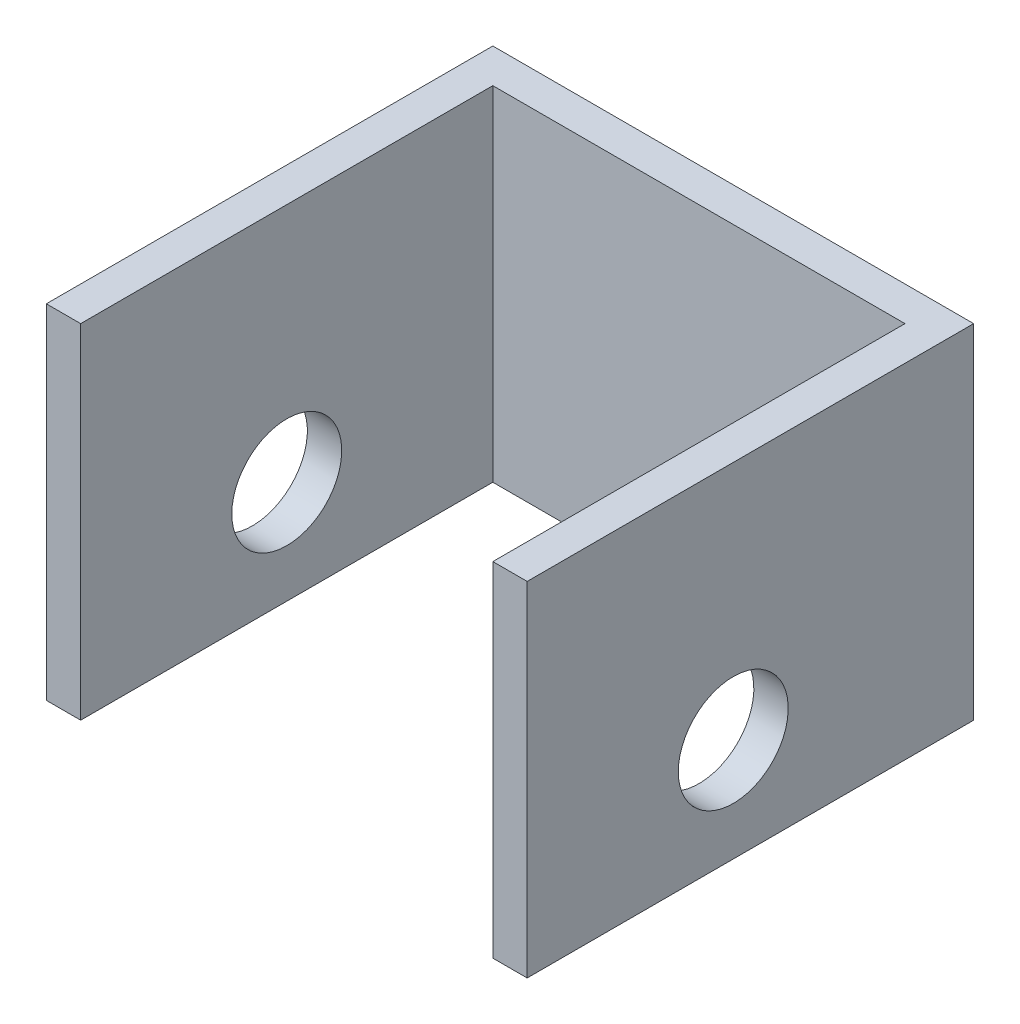
ISO-10303-21;
HEADER;
FILE_DESCRIPTION(('STEP AP214'),'2;1');
FILE_NAME('part.step','',(''),(''),'','','');
FILE_SCHEMA(('AUTOMOTIVE_DESIGN { 1 0 10303 214 1 1 1 1 }'));
ENDSEC;
DATA;
#1=APPLICATION_CONTEXT('core data for automotive mechanical design processes');
#2=APPLICATION_PROTOCOL_DEFINITION('international standard','automotive_design',2000,#1);
#3=PRODUCT_CONTEXT('',#1,'mechanical');
#4=PRODUCT('Part','Part','',(#3));
#5=PRODUCT_RELATED_PRODUCT_CATEGORY('part','',(#4));
#6=PRODUCT_DEFINITION_FORMATION('','',#4);
#7=PRODUCT_DEFINITION_CONTEXT('part definition',#1,'design');
#8=PRODUCT_DEFINITION('design','',#6,#7);
#9=PRODUCT_DEFINITION_SHAPE('','',#8);
#10=(LENGTH_UNIT() NAMED_UNIT(*) SI_UNIT(.MILLI.,.METRE.));
#11=(NAMED_UNIT(*) PLANE_ANGLE_UNIT() SI_UNIT($,.RADIAN.));
#12=(NAMED_UNIT(*) SI_UNIT($,.STERADIAN.) SOLID_ANGLE_UNIT());
#13=UNCERTAINTY_MEASURE_WITH_UNIT(LENGTH_MEASURE(1.E-05),#10,'distance_accuracy_value','');
#14=(GEOMETRIC_REPRESENTATION_CONTEXT(3) GLOBAL_UNCERTAINTY_ASSIGNED_CONTEXT((#13)) GLOBAL_UNIT_ASSIGNED_CONTEXT((#10,
#11,#12)) REPRESENTATION_CONTEXT('',''));
#15=CARTESIAN_POINT('',(0.,0.,0.));
#16=DIRECTION('',(0.,0.,1.));
#17=DIRECTION('',(1.,0.,0.));
#18=AXIS2_PLACEMENT_3D('',#15,#16,#17);
#19=CARTESIAN_POINT('',(0.,0.,5.));
#20=DIRECTION('',(0.,0.,-1.));
#21=DIRECTION('',(-1.,0.,0.));
#22=AXIS2_PLACEMENT_3D('',#19,#20,#21);
#23=PLANE('',#22);
#24=DIRECTION('',(0.,-1.,0.));
#25=VECTOR('',#24,1.);
#26=CARTESIAN_POINT('',(65.,50.,5.));
#27=LINE('',#26,#25);
#28=CARTESIAN_POINT('',(65.,50.,5.));
#29=VERTEX_POINT('',#28);
#30=CARTESIAN_POINT('',(65.,0.,5.));
#31=VERTEX_POINT('',#30);
#32=EDGE_CURVE('E123',#29,#31,#27,.T.);
#33=ORIENTED_EDGE('',*,*,#32,.F.);
#34=DIRECTION('',(-1.,0.,0.));
#35=VECTOR('',#34,1.);
#36=CARTESIAN_POINT('',(0.,50.,5.));
#37=LINE('',#36,#35);
#38=CARTESIAN_POINT('',(5.,50.,5.));
#39=VERTEX_POINT('',#38);
#40=EDGE_CURVE('E155',#29,#39,#37,.T.);
#41=ORIENTED_EDGE('',*,*,#40,.T.);
#42=DIRECTION('',(0.,1.,0.));
#43=VECTOR('',#42,1.);
#44=CARTESIAN_POINT('',(5.,50.,5.));
#45=LINE('',#44,#43);
#46=CARTESIAN_POINT('',(5.,0.,5.));
#47=VERTEX_POINT('',#46);
#48=EDGE_CURVE('E54',#47,#39,#45,.T.);
#49=ORIENTED_EDGE('',*,*,#48,.F.);
#50=DIRECTION('',(1.,0.,0.));
#51=VECTOR('',#50,1.);
#52=CARTESIAN_POINT('',(0.,0.,5.));
#53=LINE('',#52,#51);
#54=EDGE_CURVE('E49',#47,#31,#53,.T.);
#55=ORIENTED_EDGE('',*,*,#54,.T.);
#56=EDGE_LOOP('',(#33,#41,#49,#55));
#57=FACE_BOUND('',#56,.T.);
#58=ADVANCED_FACE('F33',(#57),#23,.F.);
#59=CARTESIAN_POINT('',(0.,0.,5.));
#60=DIRECTION('',(1.,0.,0.));
#61=DIRECTION('',(0.,0.,-1.));
#62=AXIS2_PLACEMENT_3D('',#59,#60,#61);
#63=PLANE('',#62);
#64=CARTESIAN_POINT('',(0.,15.,35.));
#65=DIRECTION('',(-1.,0.,0.));
#66=DIRECTION('',(0.,0.,1.));
#67=AXIS2_PLACEMENT_3D('',#64,#65,#66);
#68=CIRCLE('',#67,8.);
#69=CARTESIAN_POINT('',(0.,15.,43.));
#70=VERTEX_POINT('',#69);
#71=EDGE_CURVE('E307',#70,#70,#68,.T.);
#72=ORIENTED_EDGE('',*,*,#71,.F.);
#73=EDGE_LOOP('',(#72));
#74=FACE_BOUND('',#73,.T.);
#75=DIRECTION('',(0.,-1.,0.));
#76=VECTOR('',#75,1.);
#77=CARTESIAN_POINT('',(0.,0.,0.));
#78=LINE('',#77,#76);
#79=CARTESIAN_POINT('',(0.,50.,0.));
#80=VERTEX_POINT('',#79);
#81=CARTESIAN_POINT('',(0.,0.,0.));
#82=VERTEX_POINT('',#81);
#83=EDGE_CURVE('E153',#80,#82,#78,.T.);
#84=ORIENTED_EDGE('',*,*,#83,.T.);
#85=DIRECTION('',(0.,0.,-1.));
#86=VECTOR('',#85,1.);
#87=CARTESIAN_POINT('',(0.,0.,5.));
#88=LINE('',#87,#86);
#89=CARTESIAN_POINT('',(0.,0.,65.));
#90=VERTEX_POINT('',#89);
#91=EDGE_CURVE('E11',#90,#82,#88,.T.);
#92=ORIENTED_EDGE('',*,*,#91,.F.);
#93=DIRECTION('',(0.,-1.,0.));
#94=VECTOR('',#93,1.);
#95=CARTESIAN_POINT('',(0.,50.,65.));
#96=LINE('',#95,#94);
#97=CARTESIAN_POINT('',(0.,50.,65.));
#98=VERTEX_POINT('',#97);
#99=EDGE_CURVE('E136',#98,#90,#96,.T.);
#100=ORIENTED_EDGE('',*,*,#99,.F.);
#101=DIRECTION('',(0.,0.,-1.));
#102=VECTOR('',#101,1.);
#103=CARTESIAN_POINT('',(0.,50.,5.));
#104=LINE('',#103,#102);
#105=EDGE_CURVE('E108',#98,#80,#104,.T.);
#106=ORIENTED_EDGE('',*,*,#105,.T.);
#107=EDGE_LOOP('',(#84,#92,#100,#106));
#108=FACE_BOUND('',#107,.T.);
#109=ADVANCED_FACE('F35',(#74,#108),#63,.F.);
#110=CARTESIAN_POINT('',(0.,0.,5.));
#111=DIRECTION('',(0.,1.,0.));
#112=DIRECTION('',(0.,0.,1.));
#113=AXIS2_PLACEMENT_3D('',#110,#111,#112);
#114=PLANE('',#113);
#115=DIRECTION('',(1.,0.,0.));
#116=VECTOR('',#115,1.);
#117=CARTESIAN_POINT('',(0.,0.,0.));
#118=LINE('',#117,#116);
#119=CARTESIAN_POINT('',(70.,0.,0.));
#120=VERTEX_POINT('',#119);
#121=EDGE_CURVE('E160',#82,#120,#118,.T.);
#122=ORIENTED_EDGE('',*,*,#121,.T.);
#123=DIRECTION('',(0.,0.,-1.));
#124=VECTOR('',#123,1.);
#125=CARTESIAN_POINT('',(70.,0.,5.));
#126=LINE('',#125,#124);
#127=CARTESIAN_POINT('',(70.,0.,65.));
#128=VERTEX_POINT('',#127);
#129=EDGE_CURVE('E42',#128,#120,#126,.T.);
#130=ORIENTED_EDGE('',*,*,#129,.F.);
#131=DIRECTION('',(1.,0.,0.));
#132=VECTOR('',#131,1.);
#133=CARTESIAN_POINT('',(70.,0.,65.));
#134=LINE('',#133,#132);
#135=CARTESIAN_POINT('',(65.,0.,65.));
#136=VERTEX_POINT('',#135);
#137=EDGE_CURVE('E122',#136,#128,#134,.T.);
#138=ORIENTED_EDGE('',*,*,#137,.F.);
#139=DIRECTION('',(0.,0.,-1.));
#140=VECTOR('',#139,1.);
#141=CARTESIAN_POINT('',(65.,0.,65.));
#142=LINE('',#141,#140);
#143=EDGE_CURVE('E131',#136,#31,#142,.T.);
#144=ORIENTED_EDGE('',*,*,#143,.T.);
#145=ORIENTED_EDGE('',*,*,#54,.F.);
#146=DIRECTION('',(0.,0.,-1.));
#147=VECTOR('',#146,1.);
#148=CARTESIAN_POINT('',(5.00000000000001,0.,65.));
#149=LINE('',#148,#147);
#150=CARTESIAN_POINT('',(5.00000000000001,0.,65.));
#151=VERTEX_POINT('',#150);
#152=EDGE_CURVE('E150',#151,#47,#149,.T.);
#153=ORIENTED_EDGE('',*,*,#152,.F.);
#154=DIRECTION('',(1.,0.,0.));
#155=VECTOR('',#154,1.);
#156=CARTESIAN_POINT('',(0.,0.,65.));
#157=LINE('',#156,#155);
#158=EDGE_CURVE('E139',#90,#151,#157,.T.);
#159=ORIENTED_EDGE('',*,*,#158,.F.);
#160=ORIENTED_EDGE('',*,*,#91,.T.);
#161=EDGE_LOOP('',(#122,#130,#138,#144,#145,#153,#159,#160));
#162=FACE_BOUND('',#161,.T.);
#163=ADVANCED_FACE('F181',(#162),#114,.F.);
#164=CARTESIAN_POINT('',(70.,0.,5.));
#165=DIRECTION('',(-1.,0.,0.));
#166=DIRECTION('',(0.,0.,1.));
#167=AXIS2_PLACEMENT_3D('',#164,#165,#166);
#168=PLANE('',#167);
#169=CARTESIAN_POINT('',(70.,15.,35.));
#170=DIRECTION('',(-1.,0.,0.));
#171=DIRECTION('',(0.,0.,1.));
#172=AXIS2_PLACEMENT_3D('',#169,#170,#171);
#173=CIRCLE('',#172,8.);
#174=CARTESIAN_POINT('',(70.,15.,43.));
#175=VERTEX_POINT('',#174);
#176=EDGE_CURVE('E311',#175,#175,#173,.T.);
#177=ORIENTED_EDGE('',*,*,#176,.T.);
#178=EDGE_LOOP('',(#177));
#179=FACE_BOUND('',#178,.T.);
#180=DIRECTION('',(0.,1.,0.));
#181=VECTOR('',#180,1.);
#182=CARTESIAN_POINT('',(70.,0.,0.));
#183=LINE('',#182,#181);
#184=CARTESIAN_POINT('',(70.,50.,0.));
#185=VERTEX_POINT('',#184);
#186=EDGE_CURVE('E105',#120,#185,#183,.T.);
#187=ORIENTED_EDGE('',*,*,#186,.T.);
#188=DIRECTION('',(0.,0.,-1.));
#189=VECTOR('',#188,1.);
#190=CARTESIAN_POINT('',(70.,50.,5.));
#191=LINE('',#190,#189);
#192=CARTESIAN_POINT('',(70.,50.,65.));
#193=VERTEX_POINT('',#192);
#194=EDGE_CURVE('E98',#193,#185,#191,.T.);
#195=ORIENTED_EDGE('',*,*,#194,.F.);
#196=DIRECTION('',(0.,1.,0.));
#197=VECTOR('',#196,1.);
#198=CARTESIAN_POINT('',(70.,50.,65.));
#199=LINE('',#198,#197);
#200=EDGE_CURVE('E103',#128,#193,#199,.T.);
#201=ORIENTED_EDGE('',*,*,#200,.F.);
#202=ORIENTED_EDGE('',*,*,#129,.T.);
#203=EDGE_LOOP('',(#187,#195,#201,#202));
#204=FACE_BOUND('',#203,.T.);
#205=ADVANCED_FACE('F100',(#179,#204),#168,.F.);
#206=CARTESIAN_POINT('',(0.,50.,5.));
#207=DIRECTION('',(0.,-1.,0.));
#208=DIRECTION('',(0.,0.,-1.));
#209=AXIS2_PLACEMENT_3D('',#206,#207,#208);
#210=PLANE('',#209);
#211=DIRECTION('',(-1.,0.,0.));
#212=VECTOR('',#211,1.);
#213=CARTESIAN_POINT('',(0.,50.,0.));
#214=LINE('',#213,#212);
#215=EDGE_CURVE('E156',#185,#80,#214,.T.);
#216=ORIENTED_EDGE('',*,*,#215,.T.);
#217=ORIENTED_EDGE('',*,*,#105,.F.);
#218=DIRECTION('',(-1.,0.,0.));
#219=VECTOR('',#218,1.);
#220=CARTESIAN_POINT('',(0.,50.,65.));
#221=LINE('',#220,#219);
#222=CARTESIAN_POINT('',(5.,50.,65.));
#223=VERTEX_POINT('',#222);
#224=EDGE_CURVE('E143',#223,#98,#221,.T.);
#225=ORIENTED_EDGE('',*,*,#224,.F.);
#226=DIRECTION('',(0.,0.,-1.));
#227=VECTOR('',#226,1.);
#228=CARTESIAN_POINT('',(5.,50.,65.));
#229=LINE('',#228,#227);
#230=EDGE_CURVE('E146',#223,#39,#229,.T.);
#231=ORIENTED_EDGE('',*,*,#230,.T.);
#232=ORIENTED_EDGE('',*,*,#40,.F.);
#233=DIRECTION('',(0.,0.,-1.));
#234=VECTOR('',#233,1.);
#235=CARTESIAN_POINT('',(65.,50.,65.));
#236=LINE('',#235,#234);
#237=CARTESIAN_POINT('',(65.,50.,65.));
#238=VERTEX_POINT('',#237);
#239=EDGE_CURVE('E114',#238,#29,#236,.T.);
#240=ORIENTED_EDGE('',*,*,#239,.F.);
#241=DIRECTION('',(-1.,0.,0.));
#242=VECTOR('',#241,1.);
#243=CARTESIAN_POINT('',(70.,50.,65.));
#244=LINE('',#243,#242);
#245=EDGE_CURVE('E111',#193,#238,#244,.T.);
#246=ORIENTED_EDGE('',*,*,#245,.F.);
#247=ORIENTED_EDGE('',*,*,#194,.T.);
#248=EDGE_LOOP('',(#216,#217,#225,#231,#232,#240,#246,#247));
#249=FACE_BOUND('',#248,.T.);
#250=ADVANCED_FACE('F112',(#249),#210,.F.);
#251=CARTESIAN_POINT('',(0.,0.,0.));
#252=DIRECTION('',(0.,0.,-1.));
#253=DIRECTION('',(-1.,0.,0.));
#254=AXIS2_PLACEMENT_3D('',#251,#252,#253);
#255=PLANE('',#254);
#256=ORIENTED_EDGE('',*,*,#83,.F.);
#257=ORIENTED_EDGE('',*,*,#215,.F.);
#258=ORIENTED_EDGE('',*,*,#186,.F.);
#259=ORIENTED_EDGE('',*,*,#121,.F.);
#260=EDGE_LOOP('',(#256,#257,#258,#259));
#261=FACE_BOUND('',#260,.T.);
#262=ADVANCED_FACE('F169',(#261),#255,.T.);
#263=CARTESIAN_POINT('',(5.,50.,65.));
#264=DIRECTION('',(-1.,0.,0.));
#265=DIRECTION('',(0.,-1.,0.));
#266=AXIS2_PLACEMENT_3D('',#263,#264,#265);
#267=PLANE('',#266);
#268=CARTESIAN_POINT('',(5.,15.,35.));
#269=DIRECTION('',(-1.,0.,0.));
#270=DIRECTION('',(0.,-1.,0.));
#271=AXIS2_PLACEMENT_3D('',#268,#269,#270);
#272=CIRCLE('',#271,8.);
#273=CARTESIAN_POINT('',(5.00000000000001,7.,35.));
#274=VERTEX_POINT('',#273);
#275=EDGE_CURVE('E125',#274,#274,#272,.T.);
#276=ORIENTED_EDGE('',*,*,#275,.T.);
#277=EDGE_LOOP('',(#276));
#278=FACE_BOUND('',#277,.T.);
#279=ORIENTED_EDGE('',*,*,#48,.T.);
#280=ORIENTED_EDGE('',*,*,#230,.F.);
#281=DIRECTION('',(0.,1.,0.));
#282=VECTOR('',#281,1.);
#283=CARTESIAN_POINT('',(5.,50.,65.));
#284=LINE('',#283,#282);
#285=EDGE_CURVE('E141',#151,#223,#284,.T.);
#286=ORIENTED_EDGE('',*,*,#285,.F.);
#287=ORIENTED_EDGE('',*,*,#152,.T.);
#288=EDGE_LOOP('',(#279,#280,#286,#287));
#289=FACE_BOUND('',#288,.T.);
#290=ADVANCED_FACE('F180',(#278,#289),#267,.F.);
#291=CARTESIAN_POINT('',(0.,0.,65.));
#292=DIRECTION('',(0.,0.,1.));
#293=DIRECTION('',(1.,0.,0.));
#294=AXIS2_PLACEMENT_3D('',#291,#292,#293);
#295=PLANE('',#294);
#296=ORIENTED_EDGE('',*,*,#99,.T.);
#297=ORIENTED_EDGE('',*,*,#158,.T.);
#298=ORIENTED_EDGE('',*,*,#285,.T.);
#299=ORIENTED_EDGE('',*,*,#224,.T.);
#300=EDGE_LOOP('',(#296,#297,#298,#299));
#301=FACE_BOUND('',#300,.T.);
#302=ADVANCED_FACE('F175',(#301),#295,.T.);
#303=CARTESIAN_POINT('',(65.,50.,65.));
#304=DIRECTION('',(1.,0.,0.));
#305=DIRECTION('',(0.,1.,0.));
#306=AXIS2_PLACEMENT_3D('',#303,#304,#305);
#307=PLANE('',#306);
#308=CARTESIAN_POINT('',(65.,15.,35.));
#309=DIRECTION('',(1.,0.,0.));
#310=DIRECTION('',(0.,1.,0.));
#311=AXIS2_PLACEMENT_3D('',#308,#309,#310);
#312=CIRCLE('',#311,8.);
#313=CARTESIAN_POINT('',(65.,23.,35.));
#314=VERTEX_POINT('',#313);
#315=EDGE_CURVE('E37',#314,#314,#312,.T.);
#316=ORIENTED_EDGE('',*,*,#315,.T.);
#317=EDGE_LOOP('',(#316));
#318=FACE_BOUND('',#317,.T.);
#319=ORIENTED_EDGE('',*,*,#32,.T.);
#320=ORIENTED_EDGE('',*,*,#143,.F.);
#321=DIRECTION('',(0.,-1.,0.));
#322=VECTOR('',#321,1.);
#323=CARTESIAN_POINT('',(65.,50.,65.));
#324=LINE('',#323,#322);
#325=EDGE_CURVE('E117',#238,#136,#324,.T.);
#326=ORIENTED_EDGE('',*,*,#325,.F.);
#327=ORIENTED_EDGE('',*,*,#239,.T.);
#328=EDGE_LOOP('',(#319,#320,#326,#327));
#329=FACE_BOUND('',#328,.T.);
#330=ADVANCED_FACE('F184',(#318,#329),#307,.F.);
#331=CARTESIAN_POINT('',(0.,0.,65.));
#332=DIRECTION('',(0.,0.,-1.));
#333=DIRECTION('',(-1.,0.,0.));
#334=AXIS2_PLACEMENT_3D('',#331,#332,#333);
#335=PLANE('',#334);
#336=ORIENTED_EDGE('',*,*,#200,.T.);
#337=ORIENTED_EDGE('',*,*,#245,.T.);
#338=ORIENTED_EDGE('',*,*,#325,.T.);
#339=ORIENTED_EDGE('',*,*,#137,.T.);
#340=EDGE_LOOP('',(#336,#337,#338,#339));
#341=FACE_BOUND('',#340,.T.);
#342=ADVANCED_FACE('F120',(#341),#335,.F.);
#343=CARTESIAN_POINT('',(70.,15.,35.));
#344=DIRECTION('',(-1.,0.,0.));
#345=DIRECTION('',(0.,0.,1.));
#346=AXIS2_PLACEMENT_3D('',#343,#344,#345);
#347=CYLINDRICAL_SURFACE('',#346,8.);
#348=ORIENTED_EDGE('',*,*,#176,.F.);
#349=EDGE_LOOP('',(#348));
#350=FACE_BOUND('',#349,.T.);
#351=ORIENTED_EDGE('',*,*,#315,.F.);
#352=EDGE_LOOP('',(#351));
#353=FACE_BOUND('',#352,.T.);
#354=ADVANCED_FACE('F242',(#350,#353),#347,.F.);
#355=ORIENTED_EDGE('',*,*,#71,.T.);
#356=EDGE_LOOP('',(#355));
#357=FACE_BOUND('',#356,.T.);
#358=ORIENTED_EDGE('',*,*,#275,.F.);
#359=EDGE_LOOP('',(#358));
#360=FACE_BOUND('',#359,.T.);
#361=ADVANCED_FACE('F248',(#357,#360),#347,.F.);
#362=CLOSED_SHELL('',(#58,#109,#163,#205,#250,#262,#290,#302,#330,#342,#354,#361));
#363=MANIFOLD_SOLID_BREP('B2',#362);
#364=ADVANCED_BREP_SHAPE_REPRESENTATION('',(#18,#363),#14);
#365=SHAPE_DEFINITION_REPRESENTATION(#9,#364);
ENDSEC;
END-ISO-10303-21;
